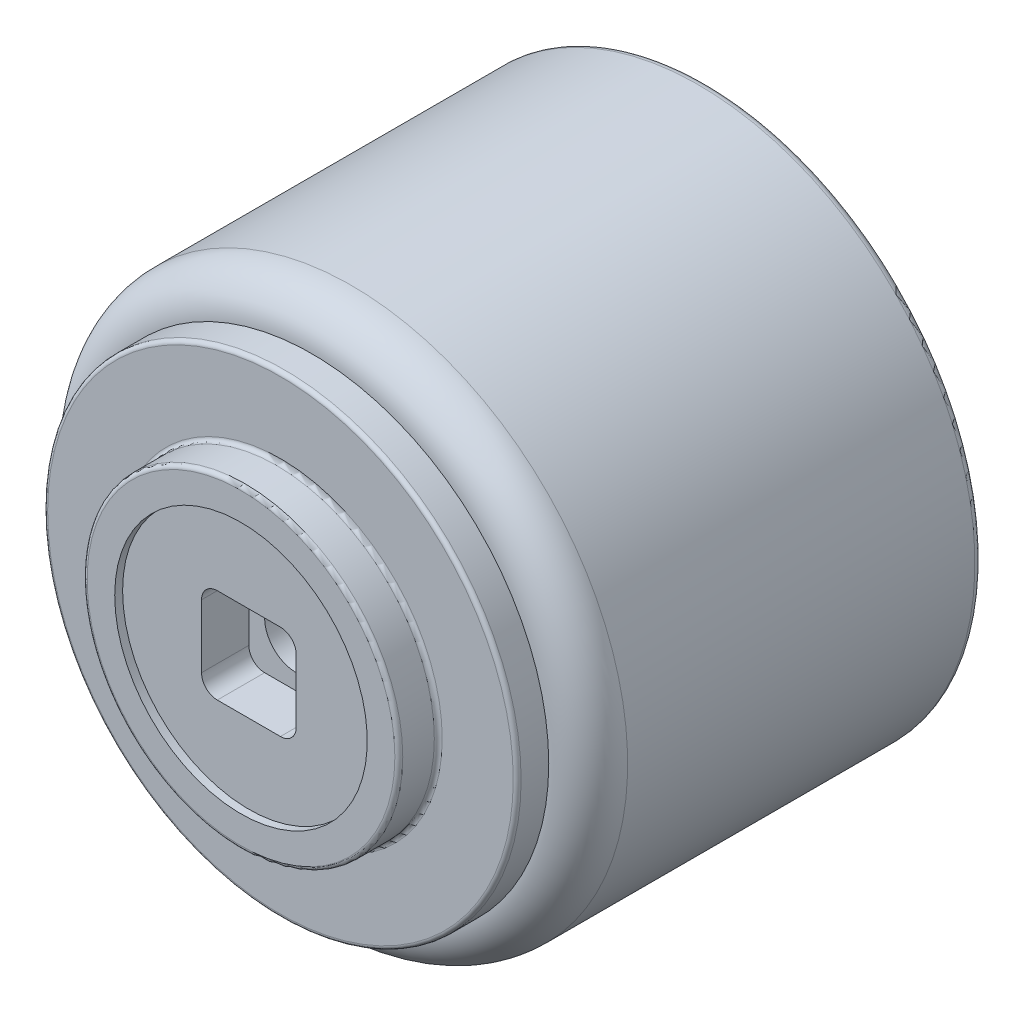
ISO-10303-21;
HEADER;
FILE_DESCRIPTION(('STEP AP214'),'2;1');
FILE_NAME('part.step','',(''),(''),'','','');
FILE_SCHEMA(('AUTOMOTIVE_DESIGN { 1 0 10303 214 1 1 1 1 }'));
ENDSEC;
DATA;
#1=APPLICATION_CONTEXT('core data for automotive mechanical design processes');
#2=APPLICATION_PROTOCOL_DEFINITION('international standard','automotive_design',2000,#1);
#3=PRODUCT_CONTEXT('',#1,'mechanical');
#4=PRODUCT('Part','Part','',(#3));
#5=PRODUCT_RELATED_PRODUCT_CATEGORY('part','',(#4));
#6=PRODUCT_DEFINITION_FORMATION('','',#4);
#7=PRODUCT_DEFINITION_CONTEXT('part definition',#1,'design');
#8=PRODUCT_DEFINITION('design','',#6,#7);
#9=PRODUCT_DEFINITION_SHAPE('','',#8);
#10=(LENGTH_UNIT() NAMED_UNIT(*) SI_UNIT(.MILLI.,.METRE.));
#11=(NAMED_UNIT(*) PLANE_ANGLE_UNIT() SI_UNIT($,.RADIAN.));
#12=(NAMED_UNIT(*) SI_UNIT($,.STERADIAN.) SOLID_ANGLE_UNIT());
#13=UNCERTAINTY_MEASURE_WITH_UNIT(LENGTH_MEASURE(1.E-05),#10,'distance_accuracy_value','');
#14=(GEOMETRIC_REPRESENTATION_CONTEXT(3) GLOBAL_UNCERTAINTY_ASSIGNED_CONTEXT((#13)) GLOBAL_UNIT_ASSIGNED_CONTEXT((#10,
#11,#12)) REPRESENTATION_CONTEXT('',''));
#15=CARTESIAN_POINT('',(0.,0.,0.));
#16=DIRECTION('',(0.,0.,1.));
#17=DIRECTION('',(1.,0.,0.));
#18=AXIS2_PLACEMENT_3D('',#15,#16,#17);
#19=CARTESIAN_POINT('',(0.,0.,54.));
#20=DIRECTION('',(0.,0.,-1.));
#21=DIRECTION('',(-1.,0.,0.));
#22=AXIS2_PLACEMENT_3D('',#19,#20,#21);
#23=CYLINDRICAL_SURFACE('',#22,30.);
#24=CARTESIAN_POINT('',(0.,0.,53.5));
#25=DIRECTION('',(0.,0.,1.));
#26=DIRECTION('',(1.,0.,0.));
#27=AXIS2_PLACEMENT_3D('',#24,#25,#26);
#28=CIRCLE('',#27,30.);
#29=CARTESIAN_POINT('',(30.,0.,53.5));
#30=VERTEX_POINT('',#29);
#31=EDGE_CURVE('E150',#30,#30,#28,.F.);
#32=ORIENTED_EDGE('',*,*,#31,.T.);
#33=EDGE_LOOP('',(#32));
#34=FACE_BOUND('',#33,.T.);
#35=CARTESIAN_POINT('',(0.,0.,50.));
#36=DIRECTION('',(0.,0.,-1.));
#37=DIRECTION('',(-1.,0.,0.));
#38=AXIS2_PLACEMENT_3D('',#35,#36,#37);
#39=CIRCLE('',#38,30.);
#40=CARTESIAN_POINT('',(-30.,0.,50.));
#41=VERTEX_POINT('',#40);
#42=EDGE_CURVE('E142',#41,#41,#39,.T.);
#43=ORIENTED_EDGE('',*,*,#42,.F.);
#44=EDGE_LOOP('',(#43));
#45=FACE_BOUND('',#44,.T.);
#46=ADVANCED_FACE('F32',(#34,#45),#23,.T.);
#47=CARTESIAN_POINT('',(30.,0.,54.));
#48=DIRECTION('',(0.,0.,1.));
#49=DIRECTION('',(1.,0.,0.));
#50=AXIS2_PLACEMENT_3D('',#47,#48,#49);
#51=PLANE('',#50);
#52=CARTESIAN_POINT('',(0.,0.,54.));
#53=DIRECTION('',(0.,0.,1.));
#54=DIRECTION('',(1.,0.,0.));
#55=AXIS2_PLACEMENT_3D('',#52,#53,#54);
#56=CIRCLE('',#55,29.5);
#57=CARTESIAN_POINT('',(29.5,0.,54.));
#58=VERTEX_POINT('',#57);
#59=EDGE_CURVE('E160',#58,#58,#56,.T.);
#60=ORIENTED_EDGE('',*,*,#59,.T.);
#61=EDGE_LOOP('',(#60));
#62=FACE_BOUND('',#61,.T.);
#63=CARTESIAN_POINT('',(0.,0.,54.));
#64=DIRECTION('',(0.,0.,1.));
#65=DIRECTION('',(1.,0.,0.));
#66=AXIS2_PLACEMENT_3D('',#63,#64,#65);
#67=CIRCLE('',#66,20.5);
#68=CARTESIAN_POINT('',(20.5,0.,54.));
#69=VERTEX_POINT('',#68);
#70=EDGE_CURVE('E157',#69,#69,#67,.F.);
#71=ORIENTED_EDGE('',*,*,#70,.T.);
#72=EDGE_LOOP('',(#71));
#73=FACE_BOUND('',#72,.T.);
#74=ADVANCED_FACE('F248',(#62,#73),#51,.T.);
#75=CARTESIAN_POINT('',(0.,0.,0.));
#76=DIRECTION('',(0.,0.,-1.));
#77=DIRECTION('',(-1.,0.,0.));
#78=AXIS2_PLACEMENT_3D('',#75,#76,#77);
#79=PLANE('',#78);
#80=CARTESIAN_POINT('',(0.,0.,0.));
#81=DIRECTION('',(0.,0.,-1.));
#82=DIRECTION('',(-1.,0.,0.));
#83=AXIS2_PLACEMENT_3D('',#80,#81,#82);
#84=CIRCLE('',#83,34.);
#85=CARTESIAN_POINT('',(-34.,0.,0.));
#86=VERTEX_POINT('',#85);
#87=EDGE_CURVE('E196',#86,#86,#84,.T.);
#88=ORIENTED_EDGE('',*,*,#87,.T.);
#89=EDGE_LOOP('',(#88));
#90=FACE_BOUND('',#89,.T.);
#91=CARTESIAN_POINT('',(0.,0.,0.));
#92=DIRECTION('',(0.,0.,-1.));
#93=DIRECTION('',(-1.,0.,0.));
#94=AXIS2_PLACEMENT_3D('',#91,#92,#93);
#95=CIRCLE('',#94,25.5);
#96=CARTESIAN_POINT('',(-25.5,0.,0.));
#97=VERTEX_POINT('',#96);
#98=EDGE_CURVE('E178',#97,#97,#95,.F.);
#99=ORIENTED_EDGE('',*,*,#98,.T.);
#100=EDGE_LOOP('',(#99));
#101=FACE_BOUND('',#100,.T.);
#102=ADVANCED_FACE('F254',(#90,#101),#79,.T.);
#103=CARTESIAN_POINT('',(0.,0.,54.));
#104=DIRECTION('',(0.,0.,-1.));
#105=DIRECTION('',(-1.,0.,0.));
#106=AXIS2_PLACEMENT_3D('',#103,#104,#105);
#107=CYLINDRICAL_SURFACE('',#106,35.);
#108=CARTESIAN_POINT('',(0.,0.,1.));
#109=DIRECTION('',(0.,0.,-1.));
#110=DIRECTION('',(-1.,0.,0.));
#111=AXIS2_PLACEMENT_3D('',#108,#109,#110);
#112=CIRCLE('',#111,35.);
#113=CARTESIAN_POINT('',(-35.,0.,1.));
#114=VERTEX_POINT('',#113);
#115=EDGE_CURVE('E199',#114,#114,#112,.F.);
#116=ORIENTED_EDGE('',*,*,#115,.T.);
#117=EDGE_LOOP('',(#116));
#118=FACE_BOUND('',#117,.T.);
#119=CARTESIAN_POINT('',(0.,0.,45.));
#120=DIRECTION('',(0.,0.,-1.));
#121=DIRECTION('',(-1.,0.,0.));
#122=AXIS2_PLACEMENT_3D('',#119,#120,#121);
#123=CIRCLE('',#122,35.);
#124=CARTESIAN_POINT('',(-35.,0.,45.));
#125=VERTEX_POINT('',#124);
#126=EDGE_CURVE('E145',#125,#125,#123,.T.);
#127=ORIENTED_EDGE('',*,*,#126,.T.);
#128=EDGE_LOOP('',(#127));
#129=FACE_BOUND('',#128,.T.);
#130=ADVANCED_FACE('F483',(#118,#129),#107,.T.);
#131=CARTESIAN_POINT('',(0.,0.,45.));
#132=DIRECTION('',(0.,0.,-1.));
#133=DIRECTION('',(-1.,0.,0.));
#134=AXIS2_PLACEMENT_3D('',#131,#132,#133);
#135=TOROIDAL_SURFACE('',#134,30.,5.);
#136=ORIENTED_EDGE('',*,*,#42,.T.);
#137=EDGE_LOOP('',(#136));
#138=FACE_BOUND('',#137,.T.);
#139=ORIENTED_EDGE('',*,*,#126,.F.);
#140=EDGE_LOOP('',(#139));
#141=FACE_BOUND('',#140,.T.);
#142=ADVANCED_FACE('F474',(#138,#141),#135,.T.);
#143=CARTESIAN_POINT('',(0.,0.,59.));
#144=DIRECTION('',(0.,0.,-1.));
#145=DIRECTION('',(-1.,0.,0.));
#146=AXIS2_PLACEMENT_3D('',#143,#144,#145);
#147=CYLINDRICAL_SURFACE('',#146,20.);
#148=CARTESIAN_POINT('',(0.,0.,54.5));
#149=DIRECTION('',(0.,0.,1.));
#150=DIRECTION('',(1.,0.,0.));
#151=AXIS2_PLACEMENT_3D('',#148,#149,#150);
#152=CIRCLE('',#151,20.);
#153=CARTESIAN_POINT('',(20.,0.,54.5));
#154=VERTEX_POINT('',#153);
#155=EDGE_CURVE('E184',#154,#154,#152,.T.);
#156=ORIENTED_EDGE('',*,*,#155,.T.);
#157=EDGE_LOOP('',(#156));
#158=FACE_BOUND('',#157,.T.);
#159=CARTESIAN_POINT('',(0.,0.,58.5));
#160=DIRECTION('',(0.,0.,1.));
#161=DIRECTION('',(1.,0.,0.));
#162=AXIS2_PLACEMENT_3D('',#159,#160,#161);
#163=CIRCLE('',#162,20.);
#164=CARTESIAN_POINT('',(20.,0.,58.5));
#165=VERTEX_POINT('',#164);
#166=EDGE_CURVE('E181',#165,#165,#163,.F.);
#167=ORIENTED_EDGE('',*,*,#166,.T.);
#168=EDGE_LOOP('',(#167));
#169=FACE_BOUND('',#168,.T.);
#170=ADVANCED_FACE('F465',(#158,#169),#147,.T.);
#171=CARTESIAN_POINT('',(0.,0.,59.));
#172=DIRECTION('',(0.,0.,1.));
#173=DIRECTION('',(1.,0.,0.));
#174=AXIS2_PLACEMENT_3D('',#171,#172,#173);
#175=PLANE('',#174);
#176=CARTESIAN_POINT('',(0.,0.,59.));
#177=DIRECTION('',(0.,0.,1.));
#178=DIRECTION('',(1.,0.,0.));
#179=AXIS2_PLACEMENT_3D('',#176,#177,#178);
#180=CIRCLE('',#179,19.5);
#181=CARTESIAN_POINT('',(19.5,0.,59.));
#182=VERTEX_POINT('',#181);
#183=EDGE_CURVE('E193',#182,#182,#180,.T.);
#184=ORIENTED_EDGE('',*,*,#183,.T.);
#185=EDGE_LOOP('',(#184));
#186=FACE_BOUND('',#185,.T.);
#187=CARTESIAN_POINT('',(0.,0.,59.));
#188=DIRECTION('',(0.,0.,-1.));
#189=DIRECTION('',(-1.,0.,0.));
#190=AXIS2_PLACEMENT_3D('',#187,#188,#189);
#191=CIRCLE('',#190,16.);
#192=CARTESIAN_POINT('',(-16.,0.,59.));
#193=VERTEX_POINT('',#192);
#194=EDGE_CURVE('E121',#193,#193,#191,.T.);
#195=ORIENTED_EDGE('',*,*,#194,.T.);
#196=EDGE_LOOP('',(#195));
#197=FACE_BOUND('',#196,.T.);
#198=ADVANCED_FACE('F422',(#186,#197),#175,.T.);
#199=CARTESIAN_POINT('',(0.,0.,2.99999999999996));
#200=DIRECTION('',(0.,0.,1.));
#201=DIRECTION('',(1.,0.,0.));
#202=AXIS2_PLACEMENT_3D('',#199,#200,#201);
#203=PLANE('',#202);
#204=CARTESIAN_POINT('',(0.,0.,2.99999999999996));
#205=DIRECTION('',(0.,0.,1.));
#206=DIRECTION('',(1.,0.,0.));
#207=AXIS2_PLACEMENT_3D('',#204,#205,#206);
#208=CIRCLE('',#207,24.5);
#209=CARTESIAN_POINT('',(24.5,0.,2.99999999999996));
#210=VERTEX_POINT('',#209);
#211=EDGE_CURVE('E190',#210,#210,#208,.F.);
#212=ORIENTED_EDGE('',*,*,#211,.T.);
#213=EDGE_LOOP('',(#212));
#214=FACE_BOUND('',#213,.T.);
#215=CARTESIAN_POINT('',(0.,0.,2.99999999999996));
#216=DIRECTION('',(0.,0.,1.));
#217=DIRECTION('',(1.,0.,0.));
#218=AXIS2_PLACEMENT_3D('',#215,#216,#217);
#219=CIRCLE('',#218,13.);
#220=CARTESIAN_POINT('',(13.,0.,2.99999999999996));
#221=VERTEX_POINT('',#220);
#222=EDGE_CURVE('E187',#221,#221,#219,.T.);
#223=ORIENTED_EDGE('',*,*,#222,.T.);
#224=EDGE_LOOP('',(#223));
#225=FACE_BOUND('',#224,.T.);
#226=ADVANCED_FACE('F413',(#214,#225),#203,.F.);
#227=CARTESIAN_POINT('',(0.,0.,0.));
#228=DIRECTION('',(0.,0.,-1.));
#229=DIRECTION('',(-1.,0.,0.));
#230=AXIS2_PLACEMENT_3D('',#227,#228,#229);
#231=CYLINDRICAL_SURFACE('',#230,25.);
#232=CARTESIAN_POINT('',(0.,0.,0.5));
#233=DIRECTION('',(0.,0.,-1.));
#234=DIRECTION('',(-1.,0.,0.));
#235=AXIS2_PLACEMENT_3D('',#232,#233,#234);
#236=CIRCLE('',#235,25.);
#237=CARTESIAN_POINT('',(-25.,0.,0.5));
#238=VERTEX_POINT('',#237);
#239=EDGE_CURVE('E175',#238,#238,#236,.T.);
#240=ORIENTED_EDGE('',*,*,#239,.T.);
#241=EDGE_LOOP('',(#240));
#242=FACE_BOUND('',#241,.T.);
#243=CARTESIAN_POINT('',(0.,0.,2.49999999999996));
#244=DIRECTION('',(0.,0.,1.));
#245=DIRECTION('',(1.,0.,0.));
#246=AXIS2_PLACEMENT_3D('',#243,#244,#245);
#247=CIRCLE('',#246,25.);
#248=CARTESIAN_POINT('',(25.,0.,2.49999999999996));
#249=VERTEX_POINT('',#248);
#250=EDGE_CURVE('E172',#249,#249,#247,.T.);
#251=ORIENTED_EDGE('',*,*,#250,.T.);
#252=EDGE_LOOP('',(#251));
#253=FACE_BOUND('',#252,.T.);
#254=ADVANCED_FACE('F404',(#242,#253),#231,.F.);
#255=CARTESIAN_POINT('',(0.,0.,1.));
#256=DIRECTION('',(0.,0.,1.));
#257=DIRECTION('',(1.,0.,0.));
#258=AXIS2_PLACEMENT_3D('',#255,#256,#257);
#259=CYLINDRICAL_SURFACE('',#258,12.5);
#260=CARTESIAN_POINT('',(0.,0.,1.5));
#261=DIRECTION('',(0.,0.,-1.));
#262=DIRECTION('',(-1.,0.,0.));
#263=AXIS2_PLACEMENT_3D('',#260,#261,#262);
#264=CIRCLE('',#263,12.5);
#265=CARTESIAN_POINT('',(-12.5,0.,1.5));
#266=VERTEX_POINT('',#265);
#267=EDGE_CURVE('E166',#266,#266,#264,.F.);
#268=ORIENTED_EDGE('',*,*,#267,.T.);
#269=EDGE_LOOP('',(#268));
#270=FACE_BOUND('',#269,.T.);
#271=CARTESIAN_POINT('',(0.,0.,2.49999999999996));
#272=DIRECTION('',(0.,0.,1.));
#273=DIRECTION('',(1.,0.,0.));
#274=AXIS2_PLACEMENT_3D('',#271,#272,#273);
#275=CIRCLE('',#274,12.5);
#276=CARTESIAN_POINT('',(12.5,0.,2.49999999999996));
#277=VERTEX_POINT('',#276);
#278=EDGE_CURVE('E163',#277,#277,#275,.F.);
#279=ORIENTED_EDGE('',*,*,#278,.T.);
#280=EDGE_LOOP('',(#279));
#281=FACE_BOUND('',#280,.T.);
#282=ADVANCED_FACE('F395',(#270,#281),#259,.T.);
#283=CARTESIAN_POINT('',(12.5,0.,1.));
#284=DIRECTION('',(0.,0.,-1.));
#285=DIRECTION('',(-1.,0.,0.));
#286=AXIS2_PLACEMENT_3D('',#283,#284,#285);
#287=PLANE('',#286);
#288=CARTESIAN_POINT('',(0.,0.,1.));
#289=DIRECTION('',(0.,0.,-1.));
#290=DIRECTION('',(-1.,0.,0.));
#291=AXIS2_PLACEMENT_3D('',#288,#289,#290);
#292=CIRCLE('',#291,12.);
#293=CARTESIAN_POINT('',(-12.,0.,1.));
#294=VERTEX_POINT('',#293);
#295=EDGE_CURVE('E169',#294,#294,#292,.T.);
#296=ORIENTED_EDGE('',*,*,#295,.T.);
#297=EDGE_LOOP('',(#296));
#298=FACE_BOUND('',#297,.T.);
#299=CARTESIAN_POINT('',(0.,0.,1.));
#300=DIRECTION('',(0.,0.,-1.));
#301=DIRECTION('',(-1.,0.,0.));
#302=AXIS2_PLACEMENT_3D('',#299,#300,#301);
#303=CIRCLE('',#302,3.99999999999998);
#304=CARTESIAN_POINT('',(-3.99999999999998,0.,1.));
#305=VERTEX_POINT('',#304);
#306=EDGE_CURVE('E151',#305,#305,#303,.T.);
#307=ORIENTED_EDGE('',*,*,#306,.F.);
#308=EDGE_LOOP('',(#307));
#309=FACE_BOUND('',#308,.T.);
#310=ADVANCED_FACE('F386',(#298,#309),#287,.T.);
#311=CARTESIAN_POINT('',(0.,0.,58.));
#312=DIRECTION('',(0.,0.,-1.));
#313=DIRECTION('',(-1.,0.,0.));
#314=AXIS2_PLACEMENT_3D('',#311,#312,#313);
#315=PLANE('',#314);
#316=CARTESIAN_POINT('',(0.,0.,58.));
#317=DIRECTION('',(0.,0.,-1.));
#318=DIRECTION('',(-1.,0.,0.));
#319=AXIS2_PLACEMENT_3D('',#316,#317,#318);
#320=CIRCLE('',#319,16.);
#321=CARTESIAN_POINT('',(-16.,0.,58.));
#322=VERTEX_POINT('',#321);
#323=EDGE_CURVE('E127',#322,#322,#320,.T.);
#324=ORIENTED_EDGE('',*,*,#323,.F.);
#325=EDGE_LOOP('',(#324));
#326=FACE_BOUND('',#325,.T.);
#327=DIRECTION('',(0.,1.,0.));
#328=VECTOR('',#327,1.);
#329=CARTESIAN_POINT('',(6.,-6.,58.));
#330=LINE('',#329,#328);
#331=CARTESIAN_POINT('',(6.,-4.,58.));
#332=VERTEX_POINT('',#331);
#333=CARTESIAN_POINT('',(6.,4.,58.));
#334=VERTEX_POINT('',#333);
#335=EDGE_CURVE('E120',#332,#334,#330,.T.);
#336=ORIENTED_EDGE('',*,*,#335,.F.);
#337=CARTESIAN_POINT('',(4.,-4.,58.));
#338=DIRECTION('',(0.,0.,-1.));
#339=DIRECTION('',(-1.,0.,0.));
#340=AXIS2_PLACEMENT_3D('',#337,#338,#339);
#341=CIRCLE('',#340,2.);
#342=CARTESIAN_POINT('',(4.,-6.,58.));
#343=VERTEX_POINT('',#342);
#344=EDGE_CURVE('E104',#332,#343,#341,.T.);
#345=ORIENTED_EDGE('',*,*,#344,.T.);
#346=DIRECTION('',(1.,0.,0.));
#347=VECTOR('',#346,1.);
#348=CARTESIAN_POINT('',(-6.,-6.,58.));
#349=LINE('',#348,#347);
#350=CARTESIAN_POINT('',(-4.,-6.,58.));
#351=VERTEX_POINT('',#350);
#352=EDGE_CURVE('E111',#351,#343,#349,.T.);
#353=ORIENTED_EDGE('',*,*,#352,.F.);
#354=CARTESIAN_POINT('',(-4.,-4.,58.));
#355=DIRECTION('',(0.,0.,-1.));
#356=DIRECTION('',(-1.,0.,0.));
#357=AXIS2_PLACEMENT_3D('',#354,#355,#356);
#358=CIRCLE('',#357,2.);
#359=CARTESIAN_POINT('',(-6.,-4.,58.));
#360=VERTEX_POINT('',#359);
#361=EDGE_CURVE('E96',#351,#360,#358,.T.);
#362=ORIENTED_EDGE('',*,*,#361,.T.);
#363=DIRECTION('',(0.,-1.,0.));
#364=VECTOR('',#363,1.);
#365=CARTESIAN_POINT('',(-6.,6.,58.));
#366=LINE('',#365,#364);
#367=CARTESIAN_POINT('',(-6.,4.,58.));
#368=VERTEX_POINT('',#367);
#369=EDGE_CURVE('E148',#368,#360,#366,.T.);
#370=ORIENTED_EDGE('',*,*,#369,.F.);
#371=CARTESIAN_POINT('',(-4.,4.,58.));
#372=DIRECTION('',(0.,0.,-1.));
#373=DIRECTION('',(-1.,0.,0.));
#374=AXIS2_PLACEMENT_3D('',#371,#372,#373);
#375=CIRCLE('',#374,2.);
#376=CARTESIAN_POINT('',(-4.,6.,58.));
#377=VERTEX_POINT('',#376);
#378=EDGE_CURVE('E40',#368,#377,#375,.T.);
#379=ORIENTED_EDGE('',*,*,#378,.T.);
#380=DIRECTION('',(-1.,0.,0.));
#381=VECTOR('',#380,1.);
#382=CARTESIAN_POINT('',(6.,6.,58.));
#383=LINE('',#382,#381);
#384=CARTESIAN_POINT('',(4.,6.,58.));
#385=VERTEX_POINT('',#384);
#386=EDGE_CURVE('E124',#385,#377,#383,.T.);
#387=ORIENTED_EDGE('',*,*,#386,.F.);
#388=CARTESIAN_POINT('',(4.,4.,58.));
#389=DIRECTION('',(0.,0.,-1.));
#390=DIRECTION('',(-1.,0.,0.));
#391=AXIS2_PLACEMENT_3D('',#388,#389,#390);
#392=CIRCLE('',#391,2.);
#393=EDGE_CURVE('E11',#385,#334,#392,.T.);
#394=ORIENTED_EDGE('',*,*,#393,.T.);
#395=EDGE_LOOP('',(#336,#345,#353,#362,#370,#379,#387,#394));
#396=FACE_BOUND('',#395,.T.);
#397=ADVANCED_FACE('F119',(#326,#396),#315,.F.);
#398=CARTESIAN_POINT('',(0.,0.,59.));
#399=DIRECTION('',(0.,0.,-1.));
#400=DIRECTION('',(-1.,0.,0.));
#401=AXIS2_PLACEMENT_3D('',#398,#399,#400);
#402=CYLINDRICAL_SURFACE('',#401,16.);
#403=ORIENTED_EDGE('',*,*,#194,.F.);
#404=EDGE_LOOP('',(#403));
#405=FACE_BOUND('',#404,.T.);
#406=ORIENTED_EDGE('',*,*,#323,.T.);
#407=EDGE_LOOP('',(#406));
#408=FACE_BOUND('',#407,.T.);
#409=ADVANCED_FACE('F373',(#405,#408),#402,.F.);
#410=CARTESIAN_POINT('',(0.,0.,52.));
#411=DIRECTION('',(0.,0.,1.));
#412=DIRECTION('',(1.,0.,0.));
#413=AXIS2_PLACEMENT_3D('',#410,#411,#412);
#414=PLANE('',#413);
#415=CARTESIAN_POINT('',(0.,0.,52.));
#416=DIRECTION('',(0.,0.,1.));
#417=DIRECTION('',(1.,0.,0.));
#418=AXIS2_PLACEMENT_3D('',#415,#416,#417);
#419=CIRCLE('',#418,3.99999999999999);
#420=CARTESIAN_POINT('',(3.99999999999999,0.,52.));
#421=VERTEX_POINT('',#420);
#422=EDGE_CURVE('E154',#421,#421,#419,.T.);
#423=ORIENTED_EDGE('',*,*,#422,.F.);
#424=EDGE_LOOP('',(#423));
#425=FACE_BOUND('',#424,.T.);
#426=DIRECTION('',(0.,-1.,0.));
#427=VECTOR('',#426,1.);
#428=CARTESIAN_POINT('',(-6.,6.,52.));
#429=LINE('',#428,#427);
#430=CARTESIAN_POINT('',(-6.,4.,52.));
#431=VERTEX_POINT('',#430);
#432=CARTESIAN_POINT('',(-6.,-4.,52.));
#433=VERTEX_POINT('',#432);
#434=EDGE_CURVE('E135',#431,#433,#429,.T.);
#435=ORIENTED_EDGE('',*,*,#434,.T.);
#436=CARTESIAN_POINT('',(-4.,-4.,52.));
#437=DIRECTION('',(0.,0.,1.));
#438=DIRECTION('',(1.,0.,0.));
#439=AXIS2_PLACEMENT_3D('',#436,#437,#438);
#440=CIRCLE('',#439,2.);
#441=CARTESIAN_POINT('',(-4.,-6.,52.));
#442=VERTEX_POINT('',#441);
#443=EDGE_CURVE('E212',#433,#442,#440,.T.);
#444=ORIENTED_EDGE('',*,*,#443,.T.);
#445=DIRECTION('',(1.,0.,0.));
#446=VECTOR('',#445,1.);
#447=CARTESIAN_POINT('',(-6.,-6.,52.));
#448=LINE('',#447,#446);
#449=CARTESIAN_POINT('',(4.,-6.,52.));
#450=VERTEX_POINT('',#449);
#451=EDGE_CURVE('E114',#442,#450,#448,.T.);
#452=ORIENTED_EDGE('',*,*,#451,.T.);
#453=CARTESIAN_POINT('',(4.,-4.,52.));
#454=DIRECTION('',(0.,0.,1.));
#455=DIRECTION('',(1.,0.,0.));
#456=AXIS2_PLACEMENT_3D('',#453,#454,#455);
#457=CIRCLE('',#456,2.);
#458=CARTESIAN_POINT('',(6.,-4.,52.));
#459=VERTEX_POINT('',#458);
#460=EDGE_CURVE('E210',#450,#459,#457,.T.);
#461=ORIENTED_EDGE('',*,*,#460,.T.);
#462=DIRECTION('',(0.,1.,0.));
#463=VECTOR('',#462,1.);
#464=CARTESIAN_POINT('',(6.,-6.,52.));
#465=LINE('',#464,#463);
#466=CARTESIAN_POINT('',(6.,4.,52.));
#467=VERTEX_POINT('',#466);
#468=EDGE_CURVE('E139',#459,#467,#465,.T.);
#469=ORIENTED_EDGE('',*,*,#468,.T.);
#470=CARTESIAN_POINT('',(4.,4.,52.));
#471=DIRECTION('',(0.,0.,1.));
#472=DIRECTION('',(1.,0.,0.));
#473=AXIS2_PLACEMENT_3D('',#470,#471,#472);
#474=CIRCLE('',#473,2.);
#475=CARTESIAN_POINT('',(4.,6.,52.));
#476=VERTEX_POINT('',#475);
#477=EDGE_CURVE('E206',#467,#476,#474,.T.);
#478=ORIENTED_EDGE('',*,*,#477,.T.);
#479=DIRECTION('',(-1.,0.,0.));
#480=VECTOR('',#479,1.);
#481=CARTESIAN_POINT('',(6.,6.,52.));
#482=LINE('',#481,#480);
#483=CARTESIAN_POINT('',(-4.,6.,52.));
#484=VERTEX_POINT('',#483);
#485=EDGE_CURVE('E132',#476,#484,#482,.T.);
#486=ORIENTED_EDGE('',*,*,#485,.T.);
#487=CARTESIAN_POINT('',(-4.,4.,52.));
#488=DIRECTION('',(0.,0.,1.));
#489=DIRECTION('',(1.,0.,0.));
#490=AXIS2_PLACEMENT_3D('',#487,#488,#489);
#491=CIRCLE('',#490,2.);
#492=EDGE_CURVE('E208',#484,#431,#491,.T.);
#493=ORIENTED_EDGE('',*,*,#492,.T.);
#494=EDGE_LOOP('',(#435,#444,#452,#461,#469,#478,#486,#493));
#495=FACE_BOUND('',#494,.T.);
#496=ADVANCED_FACE('F229',(#425,#495),#414,.T.);
#497=CARTESIAN_POINT('',(-6.,6.,52.));
#498=DIRECTION('',(-1.,0.,0.));
#499=DIRECTION('',(0.,-1.,0.));
#500=AXIS2_PLACEMENT_3D('',#497,#498,#499);
#501=PLANE('',#500);
#502=ORIENTED_EDGE('',*,*,#369,.T.);
#503=DIRECTION('',(0.,0.,1.));
#504=VECTOR('',#503,1.);
#505=CARTESIAN_POINT('',(-6.,-4.,52.));
#506=LINE('',#505,#504);
#507=EDGE_CURVE('E101',#360,#433,#506,.F.);
#508=ORIENTED_EDGE('',*,*,#507,.T.);
#509=ORIENTED_EDGE('',*,*,#434,.F.);
#510=DIRECTION('',(0.,0.,1.));
#511=VECTOR('',#510,1.);
#512=CARTESIAN_POINT('',(-6.,4.,58.));
#513=LINE('',#512,#511);
#514=EDGE_CURVE('E115',#431,#368,#513,.T.);
#515=ORIENTED_EDGE('',*,*,#514,.T.);
#516=EDGE_LOOP('',(#502,#508,#509,#515));
#517=FACE_BOUND('',#516,.T.);
#518=ADVANCED_FACE('F235',(#517),#501,.F.);
#519=CARTESIAN_POINT('',(-6.,-6.,52.));
#520=DIRECTION('',(0.,-1.,0.));
#521=DIRECTION('',(0.,0.,-1.));
#522=AXIS2_PLACEMENT_3D('',#519,#520,#521);
#523=PLANE('',#522);
#524=ORIENTED_EDGE('',*,*,#451,.F.);
#525=DIRECTION('',(0.,0.,1.));
#526=VECTOR('',#525,1.);
#527=CARTESIAN_POINT('',(-4.,-6.,58.));
#528=LINE('',#527,#526);
#529=EDGE_CURVE('E100',#442,#351,#528,.T.);
#530=ORIENTED_EDGE('',*,*,#529,.T.);
#531=ORIENTED_EDGE('',*,*,#352,.T.);
#532=DIRECTION('',(0.,0.,1.));
#533=VECTOR('',#532,1.);
#534=CARTESIAN_POINT('',(4.,-6.,52.));
#535=LINE('',#534,#533);
#536=EDGE_CURVE('E116',#343,#450,#535,.F.);
#537=ORIENTED_EDGE('',*,*,#536,.T.);
#538=EDGE_LOOP('',(#524,#530,#531,#537));
#539=FACE_BOUND('',#538,.T.);
#540=ADVANCED_FACE('F110',(#539),#523,.F.);
#541=CARTESIAN_POINT('',(6.,-6.,52.));
#542=DIRECTION('',(1.,0.,0.));
#543=DIRECTION('',(0.,0.,-1.));
#544=AXIS2_PLACEMENT_3D('',#541,#542,#543);
#545=PLANE('',#544);
#546=ORIENTED_EDGE('',*,*,#468,.F.);
#547=DIRECTION('',(0.,0.,1.));
#548=VECTOR('',#547,1.);
#549=CARTESIAN_POINT('',(6.,-4.,58.));
#550=LINE('',#549,#548);
#551=EDGE_CURVE('E216',#459,#332,#550,.T.);
#552=ORIENTED_EDGE('',*,*,#551,.T.);
#553=ORIENTED_EDGE('',*,*,#335,.T.);
#554=DIRECTION('',(0.,0.,1.));
#555=VECTOR('',#554,1.);
#556=CARTESIAN_POINT('',(6.,4.,52.));
#557=LINE('',#556,#555);
#558=EDGE_CURVE('E214',#334,#467,#557,.F.);
#559=ORIENTED_EDGE('',*,*,#558,.T.);
#560=EDGE_LOOP('',(#546,#552,#553,#559));
#561=FACE_BOUND('',#560,.T.);
#562=ADVANCED_FACE('F242',(#561),#545,.F.);
#563=CARTESIAN_POINT('',(6.,6.,52.));
#564=DIRECTION('',(0.,1.,0.));
#565=DIRECTION('',(0.,0.,1.));
#566=AXIS2_PLACEMENT_3D('',#563,#564,#565);
#567=PLANE('',#566);
#568=ORIENTED_EDGE('',*,*,#386,.T.);
#569=DIRECTION('',(0.,0.,1.));
#570=VECTOR('',#569,1.);
#571=CARTESIAN_POINT('',(-4.,6.,52.));
#572=LINE('',#571,#570);
#573=EDGE_CURVE('E105',#377,#484,#572,.F.);
#574=ORIENTED_EDGE('',*,*,#573,.T.);
#575=ORIENTED_EDGE('',*,*,#485,.F.);
#576=DIRECTION('',(0.,0.,1.));
#577=VECTOR('',#576,1.);
#578=CARTESIAN_POINT('',(4.,6.,58.));
#579=LINE('',#578,#577);
#580=EDGE_CURVE('E219',#476,#385,#579,.T.);
#581=ORIENTED_EDGE('',*,*,#580,.T.);
#582=EDGE_LOOP('',(#568,#574,#575,#581));
#583=FACE_BOUND('',#582,.T.);
#584=ADVANCED_FACE('F225',(#583),#567,.F.);
#585=CARTESIAN_POINT('',(0.,0.,52.));
#586=DIRECTION('',(0.,0.,1.));
#587=DIRECTION('',(1.,0.,0.));
#588=AXIS2_PLACEMENT_3D('',#585,#586,#587);
#589=CYLINDRICAL_SURFACE('',#588,3.99999999999998);
#590=ORIENTED_EDGE('',*,*,#306,.T.);
#591=EDGE_LOOP('',(#590));
#592=FACE_BOUND('',#591,.T.);
#593=ORIENTED_EDGE('',*,*,#422,.T.);
#594=EDGE_LOOP('',(#593));
#595=FACE_BOUND('',#594,.T.);
#596=ADVANCED_FACE('F264',(#592,#595),#589,.F.);
#597=CARTESIAN_POINT('',(0.,0.,53.5));
#598=DIRECTION('',(0.,0.,1.));
#599=DIRECTION('',(1.,0.,0.));
#600=AXIS2_PLACEMENT_3D('',#597,#598,#599);
#601=TOROIDAL_SURFACE('',#600,29.5,0.5);
#602=ORIENTED_EDGE('',*,*,#59,.F.);
#603=EDGE_LOOP('',(#602));
#604=FACE_BOUND('',#603,.T.);
#605=ORIENTED_EDGE('',*,*,#31,.F.);
#606=EDGE_LOOP('',(#605));
#607=FACE_BOUND('',#606,.T.);
#608=ADVANCED_FACE('F260',(#604,#607),#601,.T.);
#609=CARTESIAN_POINT('',(0.,0.,1.5));
#610=DIRECTION('',(0.,0.,-1.));
#611=DIRECTION('',(-1.,0.,0.));
#612=AXIS2_PLACEMENT_3D('',#609,#610,#611);
#613=TOROIDAL_SURFACE('',#612,12.,0.5);
#614=ORIENTED_EDGE('',*,*,#295,.F.);
#615=EDGE_LOOP('',(#614));
#616=FACE_BOUND('',#615,.T.);
#617=ORIENTED_EDGE('',*,*,#267,.F.);
#618=EDGE_LOOP('',(#617));
#619=FACE_BOUND('',#618,.T.);
#620=ADVANCED_FACE('F263',(#616,#619),#613,.T.);
#621=CARTESIAN_POINT('',(0.,0.,0.5));
#622=DIRECTION('',(0.,0.,-1.));
#623=DIRECTION('',(-1.,0.,0.));
#624=AXIS2_PLACEMENT_3D('',#621,#622,#623);
#625=TOROIDAL_SURFACE('',#624,25.5,0.5);
#626=ORIENTED_EDGE('',*,*,#98,.F.);
#627=EDGE_LOOP('',(#626));
#628=FACE_BOUND('',#627,.T.);
#629=ORIENTED_EDGE('',*,*,#239,.F.);
#630=EDGE_LOOP('',(#629));
#631=FACE_BOUND('',#630,.T.);
#632=ADVANCED_FACE('F268',(#628,#631),#625,.T.);
#633=CARTESIAN_POINT('',(0.,0.,54.5));
#634=DIRECTION('',(0.,0.,1.));
#635=DIRECTION('',(1.,0.,0.));
#636=AXIS2_PLACEMENT_3D('',#633,#634,#635);
#637=TOROIDAL_SURFACE('',#636,20.5,0.5);
#638=ORIENTED_EDGE('',*,*,#70,.F.);
#639=EDGE_LOOP('',(#638));
#640=FACE_BOUND('',#639,.T.);
#641=ORIENTED_EDGE('',*,*,#155,.F.);
#642=EDGE_LOOP('',(#641));
#643=FACE_BOUND('',#642,.T.);
#644=ADVANCED_FACE('F272',(#640,#643),#637,.F.);
#645=CARTESIAN_POINT('',(0.,0.,2.49999999999996));
#646=DIRECTION('',(0.,0.,1.));
#647=DIRECTION('',(1.,0.,0.));
#648=AXIS2_PLACEMENT_3D('',#645,#646,#647);
#649=TOROIDAL_SURFACE('',#648,24.5,0.5);
#650=ORIENTED_EDGE('',*,*,#250,.F.);
#651=EDGE_LOOP('',(#650));
#652=FACE_BOUND('',#651,.T.);
#653=ORIENTED_EDGE('',*,*,#211,.F.);
#654=EDGE_LOOP('',(#653));
#655=FACE_BOUND('',#654,.T.);
#656=ADVANCED_FACE('F276',(#652,#655),#649,.F.);
#657=CARTESIAN_POINT('',(0.,0.,58.5));
#658=DIRECTION('',(0.,0.,1.));
#659=DIRECTION('',(1.,0.,0.));
#660=AXIS2_PLACEMENT_3D('',#657,#658,#659);
#661=TOROIDAL_SURFACE('',#660,19.5,0.5);
#662=ORIENTED_EDGE('',*,*,#166,.F.);
#663=EDGE_LOOP('',(#662));
#664=FACE_BOUND('',#663,.T.);
#665=ORIENTED_EDGE('',*,*,#183,.F.);
#666=EDGE_LOOP('',(#665));
#667=FACE_BOUND('',#666,.T.);
#668=ADVANCED_FACE('F280',(#664,#667),#661,.T.);
#669=CARTESIAN_POINT('',(0.,0.,2.49999999999996));
#670=DIRECTION('',(0.,0.,1.));
#671=DIRECTION('',(1.,0.,0.));
#672=AXIS2_PLACEMENT_3D('',#669,#670,#671);
#673=TOROIDAL_SURFACE('',#672,13.,0.5);
#674=ORIENTED_EDGE('',*,*,#278,.F.);
#675=EDGE_LOOP('',(#674));
#676=FACE_BOUND('',#675,.T.);
#677=ORIENTED_EDGE('',*,*,#222,.F.);
#678=EDGE_LOOP('',(#677));
#679=FACE_BOUND('',#678,.T.);
#680=ADVANCED_FACE('F284',(#676,#679),#673,.F.);
#681=CARTESIAN_POINT('',(0.,0.,1.));
#682=DIRECTION('',(0.,0.,-1.));
#683=DIRECTION('',(-1.,0.,0.));
#684=AXIS2_PLACEMENT_3D('',#681,#682,#683);
#685=TOROIDAL_SURFACE('',#684,34.,1.);
#686=ORIENTED_EDGE('',*,*,#115,.F.);
#687=EDGE_LOOP('',(#686));
#688=FACE_BOUND('',#687,.T.);
#689=ORIENTED_EDGE('',*,*,#87,.F.);
#690=EDGE_LOOP('',(#689));
#691=FACE_BOUND('',#690,.T.);
#692=ADVANCED_FACE('F288',(#688,#691),#685,.T.);
#693=CARTESIAN_POINT('',(-4.,-4.,52.));
#694=DIRECTION('',(0.,0.,-1.));
#695=DIRECTION('',(-1.,0.,0.));
#696=AXIS2_PLACEMENT_3D('',#693,#694,#695);
#697=CYLINDRICAL_SURFACE('',#696,2.);
#698=ORIENTED_EDGE('',*,*,#443,.F.);
#699=ORIENTED_EDGE('',*,*,#507,.F.);
#700=ORIENTED_EDGE('',*,*,#361,.F.);
#701=ORIENTED_EDGE('',*,*,#529,.F.);
#702=EDGE_LOOP('',(#698,#699,#700,#701));
#703=FACE_BOUND('',#702,.T.);
#704=ADVANCED_FACE('F99',(#703),#697,.F.);
#705=CARTESIAN_POINT('',(4.,-4.,52.));
#706=DIRECTION('',(0.,0.,-1.));
#707=DIRECTION('',(-1.,0.,0.));
#708=AXIS2_PLACEMENT_3D('',#705,#706,#707);
#709=CYLINDRICAL_SURFACE('',#708,2.);
#710=ORIENTED_EDGE('',*,*,#460,.F.);
#711=ORIENTED_EDGE('',*,*,#536,.F.);
#712=ORIENTED_EDGE('',*,*,#344,.F.);
#713=ORIENTED_EDGE('',*,*,#551,.F.);
#714=EDGE_LOOP('',(#710,#711,#712,#713));
#715=FACE_BOUND('',#714,.T.);
#716=ADVANCED_FACE('F240',(#715),#709,.F.);
#717=CARTESIAN_POINT('',(-4.,4.,52.));
#718=DIRECTION('',(0.,0.,-1.));
#719=DIRECTION('',(-1.,0.,0.));
#720=AXIS2_PLACEMENT_3D('',#717,#718,#719);
#721=CYLINDRICAL_SURFACE('',#720,2.);
#722=ORIENTED_EDGE('',*,*,#492,.F.);
#723=ORIENTED_EDGE('',*,*,#573,.F.);
#724=ORIENTED_EDGE('',*,*,#378,.F.);
#725=ORIENTED_EDGE('',*,*,#514,.F.);
#726=EDGE_LOOP('',(#722,#723,#724,#725));
#727=FACE_BOUND('',#726,.T.);
#728=ADVANCED_FACE('F233',(#727),#721,.F.);
#729=CARTESIAN_POINT('',(4.,4.,52.));
#730=DIRECTION('',(0.,0.,-1.));
#731=DIRECTION('',(-1.,0.,0.));
#732=AXIS2_PLACEMENT_3D('',#729,#730,#731);
#733=CYLINDRICAL_SURFACE('',#732,2.);
#734=ORIENTED_EDGE('',*,*,#477,.F.);
#735=ORIENTED_EDGE('',*,*,#558,.F.);
#736=ORIENTED_EDGE('',*,*,#393,.F.);
#737=ORIENTED_EDGE('',*,*,#580,.F.);
#738=EDGE_LOOP('',(#734,#735,#736,#737));
#739=FACE_BOUND('',#738,.T.);
#740=ADVANCED_FACE('F34',(#739),#733,.F.);
#741=CLOSED_SHELL('',(#46,#74,#102,#130,#142,#170,#198,#226,#254,#282,#310,#397,#409,#496,#518,
#540,#562,#584,#596,#608,#620,#632,#644,#656,#668,#680,#692,#704,#716,#728,#740));
#742=MANIFOLD_SOLID_BREP('B2',#741);
#743=ADVANCED_BREP_SHAPE_REPRESENTATION('',(#18,#742),#14);
#744=SHAPE_DEFINITION_REPRESENTATION(#9,#743);
ENDSEC;
END-ISO-10303-21;
